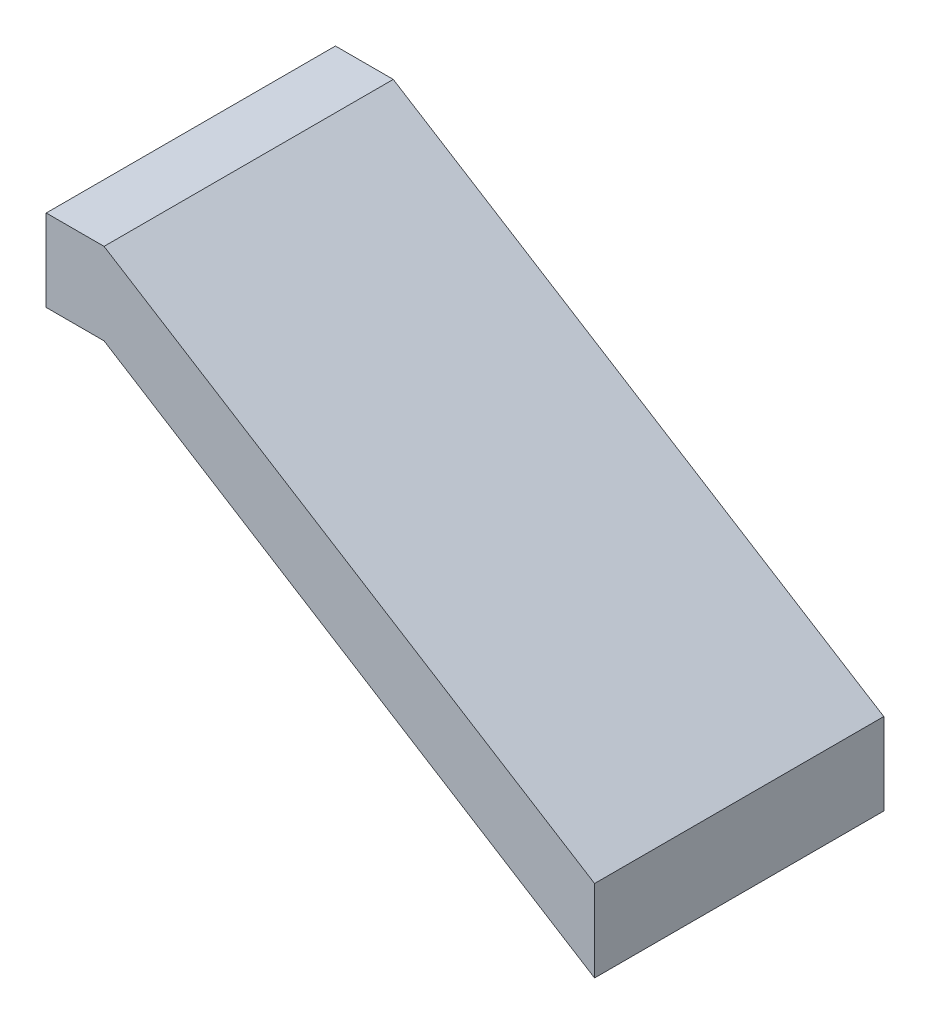
ISO-10303-21;
HEADER;
FILE_DESCRIPTION(('STEP AP214'),'2;1');
FILE_NAME('part.step','',(''),(''),'','','');
FILE_SCHEMA(('AUTOMOTIVE_DESIGN { 1 0 10303 214 1 1 1 1 }'));
ENDSEC;
DATA;
#1=APPLICATION_CONTEXT('core data for automotive mechanical design processes');
#2=APPLICATION_PROTOCOL_DEFINITION('international standard','automotive_design',2000,#1);
#3=PRODUCT_CONTEXT('',#1,'mechanical');
#4=PRODUCT('Part','Part','',(#3));
#5=PRODUCT_RELATED_PRODUCT_CATEGORY('part','',(#4));
#6=PRODUCT_DEFINITION_FORMATION('','',#4);
#7=PRODUCT_DEFINITION_CONTEXT('part definition',#1,'design');
#8=PRODUCT_DEFINITION('design','',#6,#7);
#9=PRODUCT_DEFINITION_SHAPE('','',#8);
#10=(LENGTH_UNIT() NAMED_UNIT(*) SI_UNIT(.MILLI.,.METRE.));
#11=(NAMED_UNIT(*) PLANE_ANGLE_UNIT() SI_UNIT($,.RADIAN.));
#12=(NAMED_UNIT(*) SI_UNIT($,.STERADIAN.) SOLID_ANGLE_UNIT());
#13=UNCERTAINTY_MEASURE_WITH_UNIT(LENGTH_MEASURE(1.E-05),#10,'distance_accuracy_value','');
#14=(GEOMETRIC_REPRESENTATION_CONTEXT(3) GLOBAL_UNCERTAINTY_ASSIGNED_CONTEXT((#13)) GLOBAL_UNIT_ASSIGNED_CONTEXT((#10,
#11,#12)) REPRESENTATION_CONTEXT('',''));
#15=CARTESIAN_POINT('',(0.,0.,0.));
#16=DIRECTION('',(0.,0.,1.));
#17=DIRECTION('',(1.,0.,0.));
#18=AXIS2_PLACEMENT_3D('',#15,#16,#17);
#19=CARTESIAN_POINT('',(50.,751.420672636656,500.));
#20=DIRECTION('',(1.,0.,0.));
#21=DIRECTION('',(0.,0.,-1.));
#22=AXIS2_PLACEMENT_3D('',#19,#20,#21);
#23=PLANE('',#22);
#24=DIRECTION('',(0.,-1.,0.));
#25=VECTOR('',#24,1.);
#26=CARTESIAN_POINT('',(50.,751.420672636656,0.));
#27=LINE('',#26,#25);
#28=CARTESIAN_POINT('',(50.,751.420672636656,0.));
#29=VERTEX_POINT('',#28);
#30=CARTESIAN_POINT('',(50.,609.919264233205,0.));
#31=VERTEX_POINT('',#30);
#32=EDGE_CURVE('E127',#29,#31,#27,.T.);
#33=ORIENTED_EDGE('',*,*,#32,.T.);
#34=DIRECTION('',(0.,0.,-1.));
#35=VECTOR('',#34,1.);
#36=CARTESIAN_POINT('',(50.,609.919264233205,500.));
#37=LINE('',#36,#35);
#38=CARTESIAN_POINT('',(50.,609.919264233205,500.));
#39=VERTEX_POINT('',#38);
#40=EDGE_CURVE('E11',#39,#31,#37,.T.);
#41=ORIENTED_EDGE('',*,*,#40,.F.);
#42=DIRECTION('',(0.,-1.,0.));
#43=VECTOR('',#42,1.);
#44=CARTESIAN_POINT('',(50.,751.420672636656,500.));
#45=LINE('',#44,#43);
#46=CARTESIAN_POINT('',(50.,751.420672636656,500.));
#47=VERTEX_POINT('',#46);
#48=EDGE_CURVE('E137',#47,#39,#45,.T.);
#49=ORIENTED_EDGE('',*,*,#48,.F.);
#50=DIRECTION('',(0.,0.,-1.));
#51=VECTOR('',#50,1.);
#52=CARTESIAN_POINT('',(50.,751.420672636656,500.));
#53=LINE('',#52,#51);
#54=EDGE_CURVE('E123',#47,#29,#53,.T.);
#55=ORIENTED_EDGE('',*,*,#54,.T.);
#56=EDGE_LOOP('',(#33,#41,#49,#55));
#57=FACE_BOUND('',#56,.T.);
#58=ADVANCED_FACE('F43',(#57),#23,.F.);
#59=CARTESIAN_POINT('',(50.,609.919264233205,500.));
#60=DIRECTION('',(0.,1.,0.));
#61=DIRECTION('',(0.,0.,1.));
#62=AXIS2_PLACEMENT_3D('',#59,#60,#61);
#63=PLANE('',#62);
#64=DIRECTION('',(1.,0.,0.));
#65=VECTOR('',#64,1.);
#66=CARTESIAN_POINT('',(50.,609.919264233205,0.));
#67=LINE('',#66,#65);
#68=CARTESIAN_POINT('',(150.,609.919264233205,0.));
#69=VERTEX_POINT('',#68);
#70=EDGE_CURVE('E130',#31,#69,#67,.T.);
#71=ORIENTED_EDGE('',*,*,#70,.T.);
#72=DIRECTION('',(0.,0.,-1.));
#73=VECTOR('',#72,1.);
#74=CARTESIAN_POINT('',(150.,609.919264233205,500.));
#75=LINE('',#74,#73);
#76=CARTESIAN_POINT('',(150.,609.919264233205,500.));
#77=VERTEX_POINT('',#76);
#78=EDGE_CURVE('E51',#77,#69,#75,.T.);
#79=ORIENTED_EDGE('',*,*,#78,.F.);
#80=DIRECTION('',(1.,0.,0.));
#81=VECTOR('',#80,1.);
#82=CARTESIAN_POINT('',(50.,609.919264233205,500.));
#83=LINE('',#82,#81);
#84=EDGE_CURVE('E96',#39,#77,#83,.T.);
#85=ORIENTED_EDGE('',*,*,#84,.F.);
#86=ORIENTED_EDGE('',*,*,#40,.T.);
#87=EDGE_LOOP('',(#71,#79,#85,#86));
#88=FACE_BOUND('',#87,.T.);
#89=ADVANCED_FACE('F161',(#88),#63,.F.);
#90=CARTESIAN_POINT('',(150.,609.919264233205,500.));
#91=DIRECTION('',(0.529919264233205,0.848048096156426,0.));
#92=DIRECTION('',(-0.848048096156426,0.529919264233205,0.));
#93=AXIS2_PLACEMENT_3D('',#90,#91,#92);
#94=PLANE('',#93);
#95=DIRECTION('',(0.848048096156426,-0.529919264233205,0.));
#96=VECTOR('',#95,1.);
#97=CARTESIAN_POINT('',(150.,609.919264233205,0.));
#98=LINE('',#97,#96);
#99=CARTESIAN_POINT('',(998.048096156426,80.,0.));
#100=VERTEX_POINT('',#99);
#101=EDGE_CURVE('E132',#69,#100,#98,.T.);
#102=ORIENTED_EDGE('',*,*,#101,.T.);
#103=DIRECTION('',(0.,0.,-1.));
#104=VECTOR('',#103,1.);
#105=CARTESIAN_POINT('',(998.048096156426,80.,500.));
#106=LINE('',#105,#104);
#107=CARTESIAN_POINT('',(998.048096156426,80.,500.));
#108=VERTEX_POINT('',#107);
#109=EDGE_CURVE('E118',#108,#100,#106,.T.);
#110=ORIENTED_EDGE('',*,*,#109,.F.);
#111=DIRECTION('',(0.848048096156426,-0.529919264233205,0.));
#112=VECTOR('',#111,1.);
#113=CARTESIAN_POINT('',(150.,609.919264233205,500.));
#114=LINE('',#113,#112);
#115=EDGE_CURVE('E109',#77,#108,#114,.T.);
#116=ORIENTED_EDGE('',*,*,#115,.F.);
#117=ORIENTED_EDGE('',*,*,#78,.T.);
#118=EDGE_LOOP('',(#102,#110,#116,#117));
#119=FACE_BOUND('',#118,.T.);
#120=ADVANCED_FACE('F143',(#119),#94,.F.);
#121=CARTESIAN_POINT('',(998.048096156426,80.,500.));
#122=DIRECTION('',(-1.,0.,0.));
#123=DIRECTION('',(0.,0.,1.));
#124=AXIS2_PLACEMENT_3D('',#121,#122,#123);
#125=PLANE('',#124);
#126=DIRECTION('',(0.,1.,0.));
#127=VECTOR('',#126,1.);
#128=CARTESIAN_POINT('',(998.048096156426,80.,0.));
#129=LINE('',#128,#127);
#130=CARTESIAN_POINT('',(998.048096156426,221.501408403452,0.));
#131=VERTEX_POINT('',#130);
#132=EDGE_CURVE('E117',#100,#131,#129,.T.);
#133=ORIENTED_EDGE('',*,*,#132,.T.);
#134=DIRECTION('',(0.,0.,-1.));
#135=VECTOR('',#134,1.);
#136=CARTESIAN_POINT('',(998.048096156426,221.501408403452,500.));
#137=LINE('',#136,#135);
#138=CARTESIAN_POINT('',(998.048096156426,221.501408403452,500.));
#139=VERTEX_POINT('',#138);
#140=EDGE_CURVE('E114',#139,#131,#137,.T.);
#141=ORIENTED_EDGE('',*,*,#140,.F.);
#142=DIRECTION('',(0.,1.,0.));
#143=VECTOR('',#142,1.);
#144=CARTESIAN_POINT('',(998.048096156426,80.,500.));
#145=LINE('',#144,#143);
#146=EDGE_CURVE('E103',#108,#139,#145,.T.);
#147=ORIENTED_EDGE('',*,*,#146,.F.);
#148=ORIENTED_EDGE('',*,*,#109,.T.);
#149=EDGE_LOOP('',(#133,#141,#147,#148));
#150=FACE_BOUND('',#149,.T.);
#151=ADVANCED_FACE('F115',(#150),#125,.F.);
#152=CARTESIAN_POINT('',(998.048096156426,221.501408403452,500.));
#153=DIRECTION('',(-0.529919264233205,-0.848048096156426,0.));
#154=DIRECTION('',(0.848048096156426,-0.529919264233205,0.));
#155=AXIS2_PLACEMENT_3D('',#152,#153,#154);
#156=PLANE('',#155);
#157=DIRECTION('',(-0.848048096156426,0.529919264233205,0.));
#158=VECTOR('',#157,1.);
#159=CARTESIAN_POINT('',(998.048096156426,221.501408403452,0.));
#160=LINE('',#159,#158);
#161=CARTESIAN_POINT('',(150.,751.420672636656,0.));
#162=VERTEX_POINT('',#161);
#163=EDGE_CURVE('E82',#131,#162,#160,.T.);
#164=ORIENTED_EDGE('',*,*,#163,.T.);
#165=DIRECTION('',(0.,0.,-1.));
#166=VECTOR('',#165,1.);
#167=CARTESIAN_POINT('',(150.,751.420672636656,500.));
#168=LINE('',#167,#166);
#169=CARTESIAN_POINT('',(150.,751.420672636656,500.));
#170=VERTEX_POINT('',#169);
#171=EDGE_CURVE('E119',#170,#162,#168,.T.);
#172=ORIENTED_EDGE('',*,*,#171,.F.);
#173=DIRECTION('',(-0.848048096156426,0.529919264233205,0.));
#174=VECTOR('',#173,1.);
#175=CARTESIAN_POINT('',(998.048096156426,221.501408403452,500.));
#176=LINE('',#175,#174);
#177=EDGE_CURVE('E107',#139,#170,#176,.T.);
#178=ORIENTED_EDGE('',*,*,#177,.F.);
#179=ORIENTED_EDGE('',*,*,#140,.T.);
#180=EDGE_LOOP('',(#164,#172,#178,#179));
#181=FACE_BOUND('',#180,.T.);
#182=ADVANCED_FACE('F121',(#181),#156,.F.);
#183=CARTESIAN_POINT('',(150.,751.420672636656,500.));
#184=DIRECTION('',(0.,-1.,0.));
#185=DIRECTION('',(0.,0.,-1.));
#186=AXIS2_PLACEMENT_3D('',#183,#184,#185);
#187=PLANE('',#186);
#188=DIRECTION('',(-1.,0.,0.));
#189=VECTOR('',#188,1.);
#190=CARTESIAN_POINT('',(150.,751.420672636656,0.));
#191=LINE('',#190,#189);
#192=EDGE_CURVE('E88',#162,#29,#191,.T.);
#193=ORIENTED_EDGE('',*,*,#192,.T.);
#194=ORIENTED_EDGE('',*,*,#54,.F.);
#195=DIRECTION('',(-1.,0.,0.));
#196=VECTOR('',#195,1.);
#197=CARTESIAN_POINT('',(150.,751.420672636656,500.));
#198=LINE('',#197,#196);
#199=EDGE_CURVE('E59',#170,#47,#198,.T.);
#200=ORIENTED_EDGE('',*,*,#199,.F.);
#201=ORIENTED_EDGE('',*,*,#171,.T.);
#202=EDGE_LOOP('',(#193,#194,#200,#201));
#203=FACE_BOUND('',#202,.T.);
#204=ADVANCED_FACE('F150',(#203),#187,.F.);
#205=CARTESIAN_POINT('',(0.,0.,500.));
#206=DIRECTION('',(0.,0.,1.));
#207=DIRECTION('',(1.,0.,0.));
#208=AXIS2_PLACEMENT_3D('',#205,#206,#207);
#209=PLANE('',#208);
#210=ORIENTED_EDGE('',*,*,#48,.T.);
#211=ORIENTED_EDGE('',*,*,#84,.T.);
#212=ORIENTED_EDGE('',*,*,#115,.T.);
#213=ORIENTED_EDGE('',*,*,#146,.T.);
#214=ORIENTED_EDGE('',*,*,#177,.T.);
#215=ORIENTED_EDGE('',*,*,#199,.T.);
#216=EDGE_LOOP('',(#210,#211,#212,#213,#214,#215));
#217=FACE_BOUND('',#216,.T.);
#218=ADVANCED_FACE('F105',(#217),#209,.T.);
#219=CARTESIAN_POINT('',(0.,0.,0.));
#220=DIRECTION('',(0.,0.,1.));
#221=DIRECTION('',(1.,0.,0.));
#222=AXIS2_PLACEMENT_3D('',#219,#220,#221);
#223=PLANE('',#222);
#224=ORIENTED_EDGE('',*,*,#32,.F.);
#225=ORIENTED_EDGE('',*,*,#192,.F.);
#226=ORIENTED_EDGE('',*,*,#163,.F.);
#227=ORIENTED_EDGE('',*,*,#132,.F.);
#228=ORIENTED_EDGE('',*,*,#101,.F.);
#229=ORIENTED_EDGE('',*,*,#70,.F.);
#230=EDGE_LOOP('',(#224,#225,#226,#227,#228,#229));
#231=FACE_BOUND('',#230,.T.);
#232=ADVANCED_FACE('F146',(#231),#223,.F.);
#233=CLOSED_SHELL('',(#58,#89,#120,#151,#182,#204,#218,#232));
#234=MANIFOLD_SOLID_BREP('B2',#233);
#235=ADVANCED_BREP_SHAPE_REPRESENTATION('',(#18,#234),#14);
#236=SHAPE_DEFINITION_REPRESENTATION(#9,#235);
ENDSEC;
END-ISO-10303-21;
